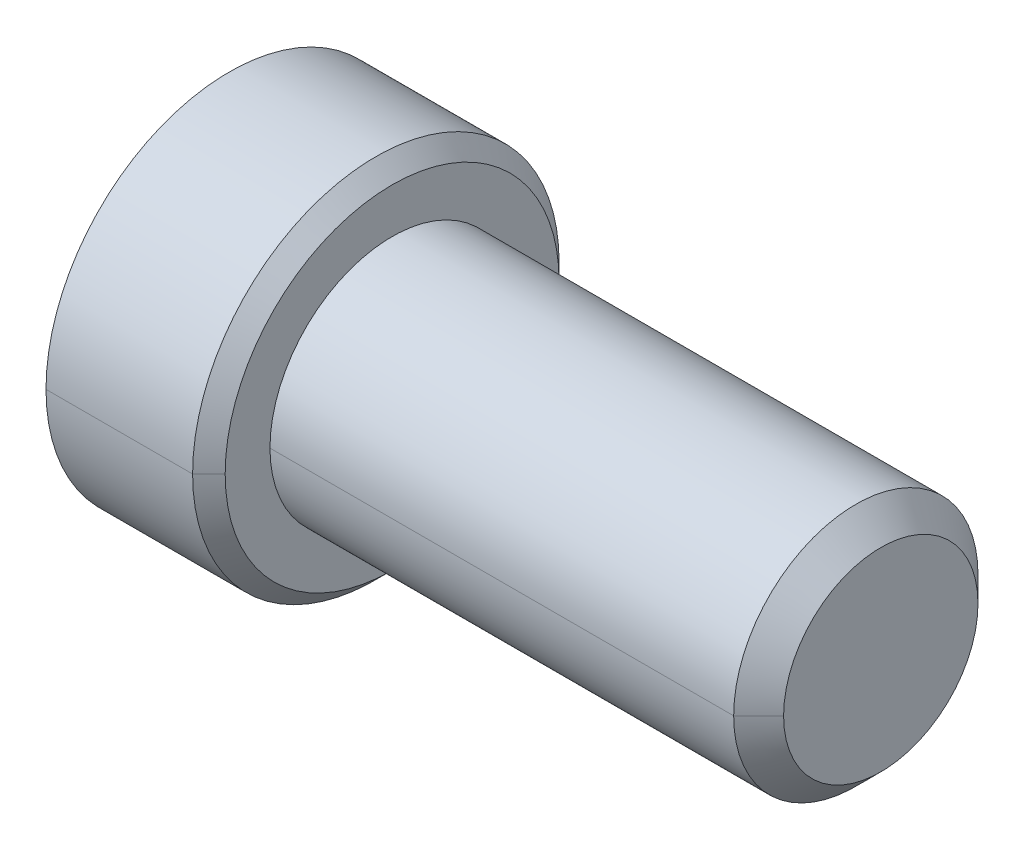
ISO-10303-21;
HEADER;
FILE_DESCRIPTION(('STEP AP214'),'2;1');
FILE_NAME('part.step','',(''),(''),'','','');
FILE_SCHEMA(('AUTOMOTIVE_DESIGN { 1 0 10303 214 1 1 1 1 }'));
ENDSEC;
DATA;
#1=APPLICATION_CONTEXT('core data for automotive mechanical design processes');
#2=APPLICATION_PROTOCOL_DEFINITION('international standard','automotive_design',2000,#1);
#3=PRODUCT_CONTEXT('',#1,'mechanical');
#4=PRODUCT('Part','Part','',(#3));
#5=PRODUCT_RELATED_PRODUCT_CATEGORY('part','',(#4));
#6=PRODUCT_DEFINITION_FORMATION('','',#4);
#7=PRODUCT_DEFINITION_CONTEXT('part definition',#1,'design');
#8=PRODUCT_DEFINITION('design','',#6,#7);
#9=PRODUCT_DEFINITION_SHAPE('','',#8);
#10=(LENGTH_UNIT() NAMED_UNIT(*) SI_UNIT(.MILLI.,.METRE.));
#11=(NAMED_UNIT(*) PLANE_ANGLE_UNIT() SI_UNIT($,.RADIAN.));
#12=(NAMED_UNIT(*) SI_UNIT($,.STERADIAN.) SOLID_ANGLE_UNIT());
#13=UNCERTAINTY_MEASURE_WITH_UNIT(LENGTH_MEASURE(1.E-05),#10,'distance_accuracy_value','');
#14=(GEOMETRIC_REPRESENTATION_CONTEXT(3) GLOBAL_UNCERTAINTY_ASSIGNED_CONTEXT((#13)) GLOBAL_UNIT_ASSIGNED_CONTEXT((#10,
#11,#12)) REPRESENTATION_CONTEXT('',''));
#15=CARTESIAN_POINT('',(0.,0.,0.));
#16=DIRECTION('',(0.,0.,1.));
#17=DIRECTION('',(1.,0.,0.));
#18=AXIS2_PLACEMENT_3D('',#15,#16,#17);
#19=CARTESIAN_POINT('',(6.,1.1935,0.));
#20=DIRECTION('',(-1.,0.,0.));
#21=DIRECTION('',(0.,0.,1.));
#22=AXIS2_PLACEMENT_3D('',#19,#20,#21);
#23=PLANE('',#22);
#24=CARTESIAN_POINT('',(6.,0.,0.));
#25=DIRECTION('',(1.,0.,0.));
#26=DIRECTION('',(0.,0.,-1.));
#27=AXIS2_PLACEMENT_3D('',#24,#25,#26);
#28=CIRCLE('',#27,1.1935);
#29=CARTESIAN_POINT('',(6.,0.,1.1935));
#30=VERTEX_POINT('',#29);
#31=CARTESIAN_POINT('',(6.,0.,-1.1935));
#32=VERTEX_POINT('',#31);
#33=EDGE_CURVE('E9',#30,#32,#28,.T.);
#34=ORIENTED_EDGE('',*,*,#33,.T.);
#35=CARTESIAN_POINT('',(6.,0.,0.));
#36=DIRECTION('',(1.,0.,0.));
#37=DIRECTION('',(0.,0.,-1.));
#38=AXIS2_PLACEMENT_3D('',#35,#36,#37);
#39=CIRCLE('',#38,1.1935);
#40=EDGE_CURVE('E375',#32,#30,#39,.T.);
#41=ORIENTED_EDGE('',*,*,#40,.T.);
#42=EDGE_LOOP('',(#34,#41));
#43=FACE_BOUND('',#42,.T.);
#44=ADVANCED_FACE('F15',(#43),#23,.F.);
#45=CARTESIAN_POINT('',(5.6935,0.,0.));
#46=DIRECTION('',(-1.,0.,0.));
#47=DIRECTION('',(0.,0.,1.));
#48=AXIS2_PLACEMENT_3D('',#45,#46,#47);
#49=CONICAL_SURFACE('',#48,1.5,0.785398163397449);
#50=DIRECTION('',(-0.707106781186547,0.,-0.707106781186548));
#51=VECTOR('',#50,1.);
#52=CARTESIAN_POINT('',(5.6935,0.,-1.5));
#53=LINE('',#52,#51);
#54=CARTESIAN_POINT('',(5.6935,0.,-1.5));
#55=VERTEX_POINT('',#54);
#56=EDGE_CURVE('E366',#32,#55,#53,.T.);
#57=ORIENTED_EDGE('',*,*,#56,.F.);
#58=ORIENTED_EDGE('',*,*,#33,.F.);
#59=DIRECTION('',(-0.707106781186547,0.,0.707106781186548));
#60=VECTOR('',#59,1.);
#61=CARTESIAN_POINT('',(5.6935,0.,1.5));
#62=LINE('',#61,#60);
#63=CARTESIAN_POINT('',(5.6935,0.,1.5));
#64=VERTEX_POINT('',#63);
#65=EDGE_CURVE('E355',#30,#64,#62,.T.);
#66=ORIENTED_EDGE('',*,*,#65,.T.);
#67=CARTESIAN_POINT('',(5.6935,0.,0.));
#68=DIRECTION('',(1.,0.,0.));
#69=DIRECTION('',(0.,0.,-1.));
#70=AXIS2_PLACEMENT_3D('',#67,#68,#69);
#71=CIRCLE('',#70,1.5);
#72=EDGE_CURVE('E23',#64,#55,#71,.T.);
#73=ORIENTED_EDGE('',*,*,#72,.T.);
#74=EDGE_LOOP('',(#57,#58,#66,#73));
#75=FACE_BOUND('',#74,.T.);
#76=ADVANCED_FACE('F416',(#75),#49,.T.);
#77=CARTESIAN_POINT('',(6.,0.,0.));
#78=DIRECTION('',(1.,0.,0.));
#79=DIRECTION('',(0.,0.,-1.));
#80=AXIS2_PLACEMENT_3D('',#77,#78,#79);
#81=CYLINDRICAL_SURFACE('',#80,1.5);
#82=DIRECTION('',(1.,0.,0.));
#83=VECTOR('',#82,1.);
#84=CARTESIAN_POINT('',(6.,0.,1.5));
#85=LINE('',#84,#83);
#86=CARTESIAN_POINT('',(0.,0.,1.5));
#87=VERTEX_POINT('',#86);
#88=EDGE_CURVE('E211',#87,#64,#85,.T.);
#89=ORIENTED_EDGE('',*,*,#88,.F.);
#90=CARTESIAN_POINT('',(0.,0.,0.));
#91=DIRECTION('',(1.,0.,0.));
#92=DIRECTION('',(0.,0.,-1.));
#93=AXIS2_PLACEMENT_3D('',#90,#91,#92);
#94=CIRCLE('',#93,1.5);
#95=CARTESIAN_POINT('',(0.,0.,-1.5));
#96=VERTEX_POINT('',#95);
#97=EDGE_CURVE('E253',#87,#96,#94,.T.);
#98=ORIENTED_EDGE('',*,*,#97,.T.);
#99=DIRECTION('',(1.,0.,0.));
#100=VECTOR('',#99,1.);
#101=CARTESIAN_POINT('',(6.,0.,-1.5));
#102=LINE('',#101,#100);
#103=EDGE_CURVE('E215',#96,#55,#102,.T.);
#104=ORIENTED_EDGE('',*,*,#103,.T.);
#105=ORIENTED_EDGE('',*,*,#72,.F.);
#106=EDGE_LOOP('',(#89,#98,#104,#105));
#107=FACE_BOUND('',#106,.T.);
#108=ADVANCED_FACE('F341',(#107),#81,.T.);
#109=CARTESIAN_POINT('',(-0.5,0.,0.));
#110=DIRECTION('',(-1.,0.,0.));
#111=DIRECTION('',(0.,0.,1.));
#112=AXIS2_PLACEMENT_3D('',#109,#110,#111);
#113=CONICAL_SURFACE('',#112,1.,1.0471975511966);
#114=DIRECTION('',(-0.5,0.,-0.866025403784439));
#115=VECTOR('',#114,1.);
#116=CARTESIAN_POINT('',(-0.5,0.,-1.));
#117=LINE('',#116,#115);
#118=CARTESIAN_POINT('',(0.077350269189626,0.,0.));
#119=VERTEX_POINT('',#118);
#120=CARTESIAN_POINT('',(-0.5,0.,-1.));
#121=VERTEX_POINT('',#120);
#122=EDGE_CURVE('E205',#119,#121,#117,.T.);
#123=ORIENTED_EDGE('',*,*,#122,.F.);
#124=DIRECTION('',(-0.5,0.,0.866025403784439));
#125=VECTOR('',#124,1.);
#126=CARTESIAN_POINT('',(-0.5,0.,1.));
#127=LINE('',#126,#125);
#128=CARTESIAN_POINT('',(-0.5,0.,1.));
#129=VERTEX_POINT('',#128);
#130=EDGE_CURVE('E216',#119,#129,#127,.T.);
#131=ORIENTED_EDGE('',*,*,#130,.T.);
#132=CARTESIAN_POINT('',(-0.5,0.,0.));
#133=DIRECTION('',(1.,0.,0.));
#134=DIRECTION('',(0.,0.866025403784422,0.500000000000029));
#135=AXIS2_PLACEMENT_3D('',#132,#133,#134);
#136=CIRCLE('',#135,1.);
#137=CARTESIAN_POINT('',(-0.5,0.866025403784442,0.50000000000004));
#138=VERTEX_POINT('',#137);
#139=EDGE_CURVE('E231',#138,#129,#136,.T.);
#140=ORIENTED_EDGE('',*,*,#139,.F.);
#141=CARTESIAN_POINT('',(-0.5,0.,0.));
#142=DIRECTION('',(1.,0.,0.));
#143=DIRECTION('',(0.,0.866025403784422,-0.500000000000029));
#144=AXIS2_PLACEMENT_3D('',#141,#142,#143);
#145=CIRCLE('',#144,1.);
#146=CARTESIAN_POINT('',(-0.5,0.866025403784442,-0.50000000000004));
#147=VERTEX_POINT('',#146);
#148=EDGE_CURVE('E227',#147,#138,#145,.T.);
#149=ORIENTED_EDGE('',*,*,#148,.F.);
#150=CARTESIAN_POINT('',(-0.5,0.,0.));
#151=DIRECTION('',(1.,0.,0.));
#152=DIRECTION('',(0.,0.,-1.));
#153=AXIS2_PLACEMENT_3D('',#150,#151,#152);
#154=CIRCLE('',#153,1.);
#155=EDGE_CURVE('E232',#121,#147,#154,.T.);
#156=ORIENTED_EDGE('',*,*,#155,.F.);
#157=EDGE_LOOP('',(#123,#131,#140,#149,#156));
#158=FACE_BOUND('',#157,.T.);
#159=ADVANCED_FACE('F404',(#158),#113,.F.);
#160=CARTESIAN_POINT('',(0.,2.05,0.));
#161=DIRECTION('',(-1.,0.,0.));
#162=DIRECTION('',(0.,0.,1.));
#163=AXIS2_PLACEMENT_3D('',#160,#161,#162);
#164=PLANE('',#163);
#165=CARTESIAN_POINT('',(0.,0.,0.));
#166=DIRECTION('',(1.,0.,0.));
#167=DIRECTION('',(0.,0.,-1.));
#168=AXIS2_PLACEMENT_3D('',#165,#166,#167);
#169=CIRCLE('',#168,1.5);
#170=EDGE_CURVE('E209',#96,#87,#169,.T.);
#171=ORIENTED_EDGE('',*,*,#170,.F.);
#172=ORIENTED_EDGE('',*,*,#97,.F.);
#173=EDGE_LOOP('',(#171,#172));
#174=FACE_BOUND('',#173,.T.);
#175=CARTESIAN_POINT('',(0.,0.,0.));
#176=DIRECTION('',(1.,0.,0.));
#177=DIRECTION('',(0.,0.,-1.));
#178=AXIS2_PLACEMENT_3D('',#175,#176,#177);
#179=CIRCLE('',#178,2.05);
#180=CARTESIAN_POINT('',(0.,0.,2.05));
#181=VERTEX_POINT('',#180);
#182=CARTESIAN_POINT('',(0.,0.,-2.05));
#183=VERTEX_POINT('',#182);
#184=EDGE_CURVE('E177',#181,#183,#179,.T.);
#185=ORIENTED_EDGE('',*,*,#184,.T.);
#186=CARTESIAN_POINT('',(0.,0.,0.));
#187=DIRECTION('',(1.,0.,0.));
#188=DIRECTION('',(0.,0.,-1.));
#189=AXIS2_PLACEMENT_3D('',#186,#187,#188);
#190=CIRCLE('',#189,2.05);
#191=EDGE_CURVE('E193',#183,#181,#190,.T.);
#192=ORIENTED_EDGE('',*,*,#191,.T.);
#193=EDGE_LOOP('',(#185,#192));
#194=FACE_BOUND('',#193,.T.);
#195=ADVANCED_FACE('F352',(#174,#194),#164,.F.);
#196=CARTESIAN_POINT('',(-0.5,0.,0.));
#197=DIRECTION('',(1.,0.,0.));
#198=DIRECTION('',(0.,1.,0.));
#199=AXIS2_PLACEMENT_3D('',#196,#197,#198);
#200=PLANE('',#199);
#201=CARTESIAN_POINT('',(-0.5,0.,0.));
#202=DIRECTION('',(1.,0.,0.));
#203=DIRECTION('',(0.,0.,1.));
#204=AXIS2_PLACEMENT_3D('',#201,#202,#203);
#205=CIRCLE('',#204,1.);
#206=CARTESIAN_POINT('',(-0.5,-0.866025403784442,0.50000000000004));
#207=VERTEX_POINT('',#206);
#208=EDGE_CURVE('E186',#129,#207,#205,.T.);
#209=ORIENTED_EDGE('',*,*,#208,.T.);
#210=DIRECTION('',(0.,-0.500000000000029,-0.866025403784422));
#211=VECTOR('',#210,1.);
#212=CARTESIAN_POINT('',(-0.5,-0.57735026918963,1.));
#213=LINE('',#212,#211);
#214=CARTESIAN_POINT('',(-0.5,-0.57735026918963,1.));
#215=VERTEX_POINT('',#214);
#216=EDGE_CURVE('E36',#215,#207,#213,.T.);
#217=ORIENTED_EDGE('',*,*,#216,.F.);
#218=DIRECTION('',(0.,-1.,0.));
#219=VECTOR('',#218,1.);
#220=CARTESIAN_POINT('',(-0.5,0.,1.));
#221=LINE('',#220,#219);
#222=EDGE_CURVE('E188',#129,#215,#221,.T.);
#223=ORIENTED_EDGE('',*,*,#222,.F.);
#224=EDGE_LOOP('',(#209,#217,#223));
#225=FACE_BOUND('',#224,.T.);
#226=ADVANCED_FACE('F187',(#225),#200,.F.);
#227=CARTESIAN_POINT('',(-0.5,0.,0.));
#228=DIRECTION('',(1.,0.,0.));
#229=DIRECTION('',(0.,1.,0.));
#230=AXIS2_PLACEMENT_3D('',#227,#228,#229);
#231=PLANE('',#230);
#232=ORIENTED_EDGE('',*,*,#139,.T.);
#233=DIRECTION('',(0.,-1.,0.));
#234=VECTOR('',#233,1.);
#235=CARTESIAN_POINT('',(-0.5,0.57735026918963,1.));
#236=LINE('',#235,#234);
#237=CARTESIAN_POINT('',(-0.5,0.57735026918963,1.));
#238=VERTEX_POINT('',#237);
#239=EDGE_CURVE('E47',#238,#129,#236,.T.);
#240=ORIENTED_EDGE('',*,*,#239,.F.);
#241=DIRECTION('',(0.,-0.500000000000029,0.866025403784422));
#242=VECTOR('',#241,1.);
#243=CARTESIAN_POINT('',(-0.5,0.866025403784442,0.50000000000004));
#244=LINE('',#243,#242);
#245=EDGE_CURVE('E275',#138,#238,#244,.T.);
#246=ORIENTED_EDGE('',*,*,#245,.F.);
#247=EDGE_LOOP('',(#232,#240,#246));
#248=FACE_BOUND('',#247,.T.);
#249=ADVANCED_FACE('F411',(#248),#231,.F.);
#250=CARTESIAN_POINT('',(-0.5,0.,0.));
#251=DIRECTION('',(1.,0.,0.));
#252=DIRECTION('',(0.,1.,0.));
#253=AXIS2_PLACEMENT_3D('',#250,#251,#252);
#254=PLANE('',#253);
#255=DIRECTION('',(0.,0.500000000000029,0.866025403784422));
#256=VECTOR('',#255,1.);
#257=CARTESIAN_POINT('',(-0.5,0.866025403784442,-0.50000000000004));
#258=LINE('',#257,#256);
#259=CARTESIAN_POINT('',(-0.5,1.1547005383793,0.));
#260=VERTEX_POINT('',#259);
#261=EDGE_CURVE('E310',#147,#260,#258,.T.);
#262=ORIENTED_EDGE('',*,*,#261,.F.);
#263=ORIENTED_EDGE('',*,*,#148,.T.);
#264=DIRECTION('',(0.,-0.500000000000029,0.866025403784422));
#265=VECTOR('',#264,1.);
#266=CARTESIAN_POINT('',(-0.5,1.1547005383793,0.));
#267=LINE('',#266,#265);
#268=EDGE_CURVE('E280',#260,#138,#267,.T.);
#269=ORIENTED_EDGE('',*,*,#268,.F.);
#270=EDGE_LOOP('',(#262,#263,#269));
#271=FACE_BOUND('',#270,.T.);
#272=ADVANCED_FACE('F476',(#271),#254,.F.);
#273=CARTESIAN_POINT('',(-0.5,0.,0.));
#274=DIRECTION('',(1.,0.,0.));
#275=DIRECTION('',(0.,1.,0.));
#276=AXIS2_PLACEMENT_3D('',#273,#274,#275);
#277=PLANE('',#276);
#278=ORIENTED_EDGE('',*,*,#155,.T.);
#279=DIRECTION('',(0.,0.500000000000029,0.866025403784422));
#280=VECTOR('',#279,1.);
#281=CARTESIAN_POINT('',(-0.5,0.57735026918963,-1.));
#282=LINE('',#281,#280);
#283=CARTESIAN_POINT('',(-0.5,0.57735026918963,-1.));
#284=VERTEX_POINT('',#283);
#285=EDGE_CURVE('E306',#284,#147,#282,.T.);
#286=ORIENTED_EDGE('',*,*,#285,.F.);
#287=DIRECTION('',(0.,1.,0.));
#288=VECTOR('',#287,1.);
#289=CARTESIAN_POINT('',(-0.5,0.,-1.));
#290=LINE('',#289,#288);
#291=EDGE_CURVE('E299',#121,#284,#290,.T.);
#292=ORIENTED_EDGE('',*,*,#291,.F.);
#293=EDGE_LOOP('',(#278,#286,#292));
#294=FACE_BOUND('',#293,.T.);
#295=ADVANCED_FACE('F472',(#294),#277,.F.);
#296=CARTESIAN_POINT('',(-0.5,0.,0.));
#297=DIRECTION('',(1.,0.,0.));
#298=DIRECTION('',(0.,1.,0.));
#299=AXIS2_PLACEMENT_3D('',#296,#297,#298);
#300=PLANE('',#299);
#301=CARTESIAN_POINT('',(-0.5,0.,0.));
#302=DIRECTION('',(1.,0.,0.));
#303=DIRECTION('',(0.,-0.866025403784422,-0.500000000000029));
#304=AXIS2_PLACEMENT_3D('',#301,#302,#303);
#305=CIRCLE('',#304,1.);
#306=CARTESIAN_POINT('',(-0.5,-0.866025403784422,-0.500000000000029));
#307=VERTEX_POINT('',#306);
#308=EDGE_CURVE('E198',#307,#121,#305,.T.);
#309=ORIENTED_EDGE('',*,*,#308,.T.);
#310=DIRECTION('',(0.,1.,0.));
#311=VECTOR('',#310,1.);
#312=CARTESIAN_POINT('',(-0.5,-0.57735026918963,-1.));
#313=LINE('',#312,#311);
#314=CARTESIAN_POINT('',(-0.5,-0.57735026918963,-1.));
#315=VERTEX_POINT('',#314);
#316=EDGE_CURVE('E295',#315,#121,#313,.T.);
#317=ORIENTED_EDGE('',*,*,#316,.F.);
#318=DIRECTION('',(0.,0.500000000000029,-0.866025403784422));
#319=VECTOR('',#318,1.);
#320=CARTESIAN_POINT('',(-0.5,-0.866025403784442,-0.500000000000041));
#321=LINE('',#320,#319);
#322=EDGE_CURVE('E288',#307,#315,#321,.T.);
#323=ORIENTED_EDGE('',*,*,#322,.F.);
#324=EDGE_LOOP('',(#309,#317,#323));
#325=FACE_BOUND('',#324,.T.);
#326=ADVANCED_FACE('F444',(#325),#300,.F.);
#327=CARTESIAN_POINT('',(-0.5,0.,0.));
#328=DIRECTION('',(1.,0.,0.));
#329=DIRECTION('',(0.,1.,0.));
#330=AXIS2_PLACEMENT_3D('',#327,#328,#329);
#331=PLANE('',#330);
#332=CARTESIAN_POINT('',(-0.5,0.,0.));
#333=DIRECTION('',(1.,0.,0.));
#334=DIRECTION('',(0.,-0.866025403784422,0.500000000000029));
#335=AXIS2_PLACEMENT_3D('',#332,#333,#334);
#336=CIRCLE('',#335,1.);
#337=EDGE_CURVE('E170',#207,#307,#336,.T.);
#338=ORIENTED_EDGE('',*,*,#337,.T.);
#339=DIRECTION('',(0.,0.500000000000029,-0.866025403784422));
#340=VECTOR('',#339,1.);
#341=CARTESIAN_POINT('',(-0.5,-1.1547005383793,0.));
#342=LINE('',#341,#340);
#343=CARTESIAN_POINT('',(-0.5,-1.1547005383793,0.));
#344=VERTEX_POINT('',#343);
#345=EDGE_CURVE('E173',#344,#307,#342,.T.);
#346=ORIENTED_EDGE('',*,*,#345,.F.);
#347=DIRECTION('',(0.,-0.500000000000029,-0.866025403784422));
#348=VECTOR('',#347,1.);
#349=CARTESIAN_POINT('',(-0.5,-0.866025403784442,0.50000000000004));
#350=LINE('',#349,#348);
#351=EDGE_CURVE('E167',#207,#344,#350,.T.);
#352=ORIENTED_EDGE('',*,*,#351,.F.);
#353=EDGE_LOOP('',(#338,#346,#352));
#354=FACE_BOUND('',#353,.T.);
#355=ADVANCED_FACE('F168',(#354),#331,.F.);
#356=CARTESIAN_POINT('',(-0.2,0.,0.));
#357=DIRECTION('',(-1.,0.,0.));
#358=DIRECTION('',(0.,0.,1.));
#359=AXIS2_PLACEMENT_3D('',#356,#357,#358);
#360=CONICAL_SURFACE('',#359,2.25,0.785398163397448);
#361=DIRECTION('',(-0.707106781186548,0.,-0.707106781186547));
#362=VECTOR('',#361,1.);
#363=CARTESIAN_POINT('',(-0.2,0.,-2.25));
#364=LINE('',#363,#362);
#365=CARTESIAN_POINT('',(-0.2,0.,-2.25));
#366=VERTEX_POINT('',#365);
#367=EDGE_CURVE('E236',#183,#366,#364,.T.);
#368=ORIENTED_EDGE('',*,*,#367,.F.);
#369=ORIENTED_EDGE('',*,*,#184,.F.);
#370=DIRECTION('',(-0.707106781186548,0.,0.707106781186547));
#371=VECTOR('',#370,1.);
#372=CARTESIAN_POINT('',(-0.2,0.,2.25));
#373=LINE('',#372,#371);
#374=CARTESIAN_POINT('',(-0.2,0.,2.25));
#375=VERTEX_POINT('',#374);
#376=EDGE_CURVE('E372',#181,#375,#373,.T.);
#377=ORIENTED_EDGE('',*,*,#376,.T.);
#378=CARTESIAN_POINT('',(-0.2,0.,0.));
#379=DIRECTION('',(1.,0.,0.));
#380=DIRECTION('',(0.,0.,-1.));
#381=AXIS2_PLACEMENT_3D('',#378,#379,#380);
#382=CIRCLE('',#381,2.25);
#383=EDGE_CURVE('E274',#375,#366,#382,.T.);
#384=ORIENTED_EDGE('',*,*,#383,.T.);
#385=EDGE_LOOP('',(#368,#369,#377,#384));
#386=FACE_BOUND('',#385,.T.);
#387=ADVANCED_FACE('F398',(#386),#360,.T.);
#388=CARTESIAN_POINT('',(-0.5,-0.57735026918963,1.));
#389=DIRECTION('',(0.,0.866025403784422,-0.500000000000029));
#390=DIRECTION('',(-1.,0.,0.));
#391=AXIS2_PLACEMENT_3D('',#388,#389,#390);
#392=PLANE('',#391);
#393=DIRECTION('',(0.,-0.500000000000029,-0.866025403784422));
#394=VECTOR('',#393,1.);
#395=CARTESIAN_POINT('',(-2.,-0.57735026918963,1.));
#396=LINE('',#395,#394);
#397=CARTESIAN_POINT('',(-2.,-0.57735026918963,1.));
#398=VERTEX_POINT('',#397);
#399=CARTESIAN_POINT('',(-2.,-1.1547005383793,0.));
#400=VERTEX_POINT('',#399);
#401=EDGE_CURVE('E270',#398,#400,#396,.T.);
#402=ORIENTED_EDGE('',*,*,#401,.F.);
#403=DIRECTION('',(-1.,0.,0.));
#404=VECTOR('',#403,1.);
#405=CARTESIAN_POINT('',(-0.5,-0.57735026918963,1.));
#406=LINE('',#405,#404);
#407=EDGE_CURVE('E181',#215,#398,#406,.T.);
#408=ORIENTED_EDGE('',*,*,#407,.F.);
#409=ORIENTED_EDGE('',*,*,#216,.T.);
#410=ORIENTED_EDGE('',*,*,#351,.T.);
#411=DIRECTION('',(-1.,0.,0.));
#412=VECTOR('',#411,1.);
#413=CARTESIAN_POINT('',(-0.5,-1.1547005383793,0.));
#414=LINE('',#413,#412);
#415=EDGE_CURVE('E283',#344,#400,#414,.T.);
#416=ORIENTED_EDGE('',*,*,#415,.T.);
#417=EDGE_LOOP('',(#402,#408,#409,#410,#416));
#418=FACE_BOUND('',#417,.T.);
#419=ADVANCED_FACE('F180',(#418),#392,.T.);
#420=CARTESIAN_POINT('',(-0.5,0.57735026918963,1.));
#421=DIRECTION('',(0.,0.,-1.));
#422=DIRECTION('',(0.,-1.,0.));
#423=AXIS2_PLACEMENT_3D('',#420,#421,#422);
#424=PLANE('',#423);
#425=DIRECTION('',(0.,-1.,0.));
#426=VECTOR('',#425,1.);
#427=CARTESIAN_POINT('',(-2.,0.57735026918963,1.));
#428=LINE('',#427,#426);
#429=CARTESIAN_POINT('',(-2.,0.57735026918963,1.));
#430=VERTEX_POINT('',#429);
#431=EDGE_CURVE('E266',#430,#398,#428,.T.);
#432=ORIENTED_EDGE('',*,*,#431,.F.);
#433=DIRECTION('',(-1.,0.,0.));
#434=VECTOR('',#433,1.);
#435=CARTESIAN_POINT('',(-0.5,0.57735026918963,1.));
#436=LINE('',#435,#434);
#437=EDGE_CURVE('E279',#238,#430,#436,.T.);
#438=ORIENTED_EDGE('',*,*,#437,.F.);
#439=ORIENTED_EDGE('',*,*,#239,.T.);
#440=ORIENTED_EDGE('',*,*,#222,.T.);
#441=ORIENTED_EDGE('',*,*,#407,.T.);
#442=EDGE_LOOP('',(#432,#438,#439,#440,#441));
#443=FACE_BOUND('',#442,.T.);
#444=ADVANCED_FACE('F440',(#443),#424,.T.);
#445=CARTESIAN_POINT('',(-0.5,1.1547005383793,0.));
#446=DIRECTION('',(0.,-0.866025403784422,-0.500000000000029));
#447=DIRECTION('',(0.,0.500000000000029,-0.866025403784422));
#448=AXIS2_PLACEMENT_3D('',#445,#446,#447);
#449=PLANE('',#448);
#450=DIRECTION('',(0.,-0.500000000000029,0.866025403784422));
#451=VECTOR('',#450,1.);
#452=CARTESIAN_POINT('',(-2.,1.1547005383793,0.));
#453=LINE('',#452,#451);
#454=CARTESIAN_POINT('',(-2.,1.1547005383793,0.));
#455=VERTEX_POINT('',#454);
#456=EDGE_CURVE('E224',#455,#430,#453,.T.);
#457=ORIENTED_EDGE('',*,*,#456,.F.);
#458=DIRECTION('',(-1.,0.,0.));
#459=VECTOR('',#458,1.);
#460=CARTESIAN_POINT('',(-0.5,1.1547005383793,0.));
#461=LINE('',#460,#459);
#462=EDGE_CURVE('E314',#260,#455,#461,.T.);
#463=ORIENTED_EDGE('',*,*,#462,.F.);
#464=ORIENTED_EDGE('',*,*,#268,.T.);
#465=ORIENTED_EDGE('',*,*,#245,.T.);
#466=ORIENTED_EDGE('',*,*,#437,.T.);
#467=EDGE_LOOP('',(#457,#463,#464,#465,#466));
#468=FACE_BOUND('',#467,.T.);
#469=ADVANCED_FACE('F436',(#468),#449,.T.);
#470=CARTESIAN_POINT('',(-0.5,0.57735026918963,-1.));
#471=DIRECTION('',(0.,-0.866025403784422,0.500000000000029));
#472=DIRECTION('',(-1.,0.,0.));
#473=AXIS2_PLACEMENT_3D('',#470,#471,#472);
#474=PLANE('',#473);
#475=DIRECTION('',(0.,0.500000000000029,0.866025403784422));
#476=VECTOR('',#475,1.);
#477=CARTESIAN_POINT('',(-2.,0.57735026918963,-1.));
#478=LINE('',#477,#476);
#479=CARTESIAN_POINT('',(-2.,0.57735026918963,-1.));
#480=VERTEX_POINT('',#479);
#481=EDGE_CURVE('E221',#480,#455,#478,.T.);
#482=ORIENTED_EDGE('',*,*,#481,.F.);
#483=DIRECTION('',(-1.,0.,0.));
#484=VECTOR('',#483,1.);
#485=CARTESIAN_POINT('',(-0.5,0.57735026918963,-1.));
#486=LINE('',#485,#484);
#487=EDGE_CURVE('E303',#284,#480,#486,.T.);
#488=ORIENTED_EDGE('',*,*,#487,.F.);
#489=ORIENTED_EDGE('',*,*,#285,.T.);
#490=ORIENTED_EDGE('',*,*,#261,.T.);
#491=ORIENTED_EDGE('',*,*,#462,.T.);
#492=EDGE_LOOP('',(#482,#488,#489,#490,#491));
#493=FACE_BOUND('',#492,.T.);
#494=ADVANCED_FACE('F439',(#493),#474,.T.);
#495=CARTESIAN_POINT('',(-0.5,-0.57735026918963,-1.));
#496=DIRECTION('',(0.,0.,1.));
#497=DIRECTION('',(1.,0.,0.));
#498=AXIS2_PLACEMENT_3D('',#495,#496,#497);
#499=PLANE('',#498);
#500=DIRECTION('',(0.,1.,0.));
#501=VECTOR('',#500,1.);
#502=CARTESIAN_POINT('',(-2.,-0.57735026918963,-1.));
#503=LINE('',#502,#501);
#504=CARTESIAN_POINT('',(-2.,-0.57735026918963,-1.));
#505=VERTEX_POINT('',#504);
#506=EDGE_CURVE('E225',#505,#480,#503,.T.);
#507=ORIENTED_EDGE('',*,*,#506,.F.);
#508=DIRECTION('',(-1.,0.,0.));
#509=VECTOR('',#508,1.);
#510=CARTESIAN_POINT('',(-0.5,-0.57735026918963,-1.));
#511=LINE('',#510,#509);
#512=EDGE_CURVE('E292',#315,#505,#511,.T.);
#513=ORIENTED_EDGE('',*,*,#512,.F.);
#514=ORIENTED_EDGE('',*,*,#316,.T.);
#515=ORIENTED_EDGE('',*,*,#291,.T.);
#516=ORIENTED_EDGE('',*,*,#487,.T.);
#517=EDGE_LOOP('',(#507,#513,#514,#515,#516));
#518=FACE_BOUND('',#517,.T.);
#519=ADVANCED_FACE('F457',(#518),#499,.T.);
#520=CARTESIAN_POINT('',(-0.5,-1.1547005383793,0.));
#521=DIRECTION('',(0.,0.866025403784422,0.500000000000029));
#522=DIRECTION('',(1.,0.,0.));
#523=AXIS2_PLACEMENT_3D('',#520,#521,#522);
#524=PLANE('',#523);
#525=DIRECTION('',(0.,0.500000000000029,-0.866025403784422));
#526=VECTOR('',#525,1.);
#527=CARTESIAN_POINT('',(-2.,-1.1547005383793,0.));
#528=LINE('',#527,#526);
#529=EDGE_CURVE('E256',#400,#505,#528,.T.);
#530=ORIENTED_EDGE('',*,*,#529,.F.);
#531=ORIENTED_EDGE('',*,*,#415,.F.);
#532=ORIENTED_EDGE('',*,*,#345,.T.);
#533=ORIENTED_EDGE('',*,*,#322,.T.);
#534=ORIENTED_EDGE('',*,*,#512,.T.);
#535=EDGE_LOOP('',(#530,#531,#532,#533,#534));
#536=FACE_BOUND('',#535,.T.);
#537=ADVANCED_FACE('F454',(#536),#524,.T.);
#538=CARTESIAN_POINT('',(6.,0.,0.));
#539=DIRECTION('',(1.,0.,0.));
#540=DIRECTION('',(0.,0.,-1.));
#541=AXIS2_PLACEMENT_3D('',#538,#539,#540);
#542=CYLINDRICAL_SURFACE('',#541,2.25);
#543=DIRECTION('',(1.,0.,0.));
#544=VECTOR('',#543,1.);
#545=CARTESIAN_POINT('',(6.,0.,2.25));
#546=LINE('',#545,#544);
#547=CARTESIAN_POINT('',(-2.,0.,2.25));
#548=VERTEX_POINT('',#547);
#549=EDGE_CURVE('E241',#548,#375,#546,.T.);
#550=ORIENTED_EDGE('',*,*,#549,.F.);
#551=CARTESIAN_POINT('',(-2.,0.,0.));
#552=DIRECTION('',(1.,0.,0.));
#553=DIRECTION('',(0.,0.,-1.));
#554=AXIS2_PLACEMENT_3D('',#551,#552,#553);
#555=CIRCLE('',#554,2.25);
#556=CARTESIAN_POINT('',(-2.,0.,-2.25));
#557=VERTEX_POINT('',#556);
#558=EDGE_CURVE('E250',#548,#557,#555,.T.);
#559=ORIENTED_EDGE('',*,*,#558,.T.);
#560=DIRECTION('',(1.,0.,0.));
#561=VECTOR('',#560,1.);
#562=CARTESIAN_POINT('',(6.,0.,-2.25));
#563=LINE('',#562,#561);
#564=EDGE_CURVE('E245',#557,#366,#563,.T.);
#565=ORIENTED_EDGE('',*,*,#564,.T.);
#566=ORIENTED_EDGE('',*,*,#383,.F.);
#567=EDGE_LOOP('',(#550,#559,#565,#566));
#568=FACE_BOUND('',#567,.T.);
#569=ADVANCED_FACE('F395',(#568),#542,.T.);
#570=CARTESIAN_POINT('',(-2.,0.,0.));
#571=DIRECTION('',(1.,0.,0.));
#572=DIRECTION('',(0.,1.,0.));
#573=AXIS2_PLACEMENT_3D('',#570,#571,#572);
#574=PLANE('',#573);
#575=ORIENTED_EDGE('',*,*,#529,.T.);
#576=ORIENTED_EDGE('',*,*,#506,.T.);
#577=ORIENTED_EDGE('',*,*,#481,.T.);
#578=ORIENTED_EDGE('',*,*,#456,.T.);
#579=ORIENTED_EDGE('',*,*,#431,.T.);
#580=ORIENTED_EDGE('',*,*,#401,.T.);
#581=EDGE_LOOP('',(#575,#576,#577,#578,#579,#580));
#582=FACE_BOUND('',#581,.T.);
#583=CARTESIAN_POINT('',(-2.,0.,0.));
#584=DIRECTION('',(1.,0.,0.));
#585=DIRECTION('',(0.,0.,-1.));
#586=AXIS2_PLACEMENT_3D('',#583,#584,#585);
#587=CIRCLE('',#586,2.25);
#588=EDGE_CURVE('E246',#557,#548,#587,.T.);
#589=ORIENTED_EDGE('',*,*,#588,.F.);
#590=ORIENTED_EDGE('',*,*,#558,.F.);
#591=EDGE_LOOP('',(#589,#590));
#592=FACE_BOUND('',#591,.T.);
#593=ADVANCED_FACE('F393',(#582,#592),#574,.F.);
#594=CARTESIAN_POINT('',(6.,0.,0.));
#595=DIRECTION('',(1.,0.,0.));
#596=DIRECTION('',(0.,0.,-1.));
#597=AXIS2_PLACEMENT_3D('',#594,#595,#596);
#598=CYLINDRICAL_SURFACE('',#597,2.25);
#599=ORIENTED_EDGE('',*,*,#588,.T.);
#600=ORIENTED_EDGE('',*,*,#549,.T.);
#601=CARTESIAN_POINT('',(-0.2,0.,0.));
#602=DIRECTION('',(1.,0.,0.));
#603=DIRECTION('',(0.,0.,-1.));
#604=AXIS2_PLACEMENT_3D('',#601,#602,#603);
#605=CIRCLE('',#604,2.25);
#606=EDGE_CURVE('E240',#366,#375,#605,.T.);
#607=ORIENTED_EDGE('',*,*,#606,.F.);
#608=ORIENTED_EDGE('',*,*,#564,.F.);
#609=EDGE_LOOP('',(#599,#600,#607,#608));
#610=FACE_BOUND('',#609,.T.);
#611=ADVANCED_FACE('F389',(#610),#598,.T.);
#612=CARTESIAN_POINT('',(-0.2,0.,0.));
#613=DIRECTION('',(-1.,0.,0.));
#614=DIRECTION('',(0.,0.,1.));
#615=AXIS2_PLACEMENT_3D('',#612,#613,#614);
#616=CONICAL_SURFACE('',#615,2.25,0.785398163397448);
#617=ORIENTED_EDGE('',*,*,#191,.F.);
#618=ORIENTED_EDGE('',*,*,#367,.T.);
#619=ORIENTED_EDGE('',*,*,#606,.T.);
#620=ORIENTED_EDGE('',*,*,#376,.F.);
#621=EDGE_LOOP('',(#617,#618,#619,#620));
#622=FACE_BOUND('',#621,.T.);
#623=ADVANCED_FACE('F402',(#622),#616,.T.);
#624=CARTESIAN_POINT('',(-0.5,0.,0.));
#625=DIRECTION('',(-1.,0.,0.));
#626=DIRECTION('',(0.,0.,1.));
#627=AXIS2_PLACEMENT_3D('',#624,#625,#626);
#628=CONICAL_SURFACE('',#627,1.,1.0471975511966);
#629=ORIENTED_EDGE('',*,*,#130,.F.);
#630=ORIENTED_EDGE('',*,*,#122,.T.);
#631=ORIENTED_EDGE('',*,*,#308,.F.);
#632=ORIENTED_EDGE('',*,*,#337,.F.);
#633=ORIENTED_EDGE('',*,*,#208,.F.);
#634=EDGE_LOOP('',(#629,#630,#631,#632,#633));
#635=FACE_BOUND('',#634,.T.);
#636=ADVANCED_FACE('F195',(#635),#628,.F.);
#637=CARTESIAN_POINT('',(6.,0.,0.));
#638=DIRECTION('',(1.,0.,0.));
#639=DIRECTION('',(0.,0.,-1.));
#640=AXIS2_PLACEMENT_3D('',#637,#638,#639);
#641=CYLINDRICAL_SURFACE('',#640,1.5);
#642=ORIENTED_EDGE('',*,*,#170,.T.);
#643=ORIENTED_EDGE('',*,*,#88,.T.);
#644=CARTESIAN_POINT('',(5.6935,0.,0.));
#645=DIRECTION('',(1.,0.,0.));
#646=DIRECTION('',(0.,0.,-1.));
#647=AXIS2_PLACEMENT_3D('',#644,#645,#646);
#648=CIRCLE('',#647,1.5);
#649=EDGE_CURVE('E349',#55,#64,#648,.T.);
#650=ORIENTED_EDGE('',*,*,#649,.F.);
#651=ORIENTED_EDGE('',*,*,#103,.F.);
#652=EDGE_LOOP('',(#642,#643,#650,#651));
#653=FACE_BOUND('',#652,.T.);
#654=ADVANCED_FACE('F347',(#653),#641,.T.);
#655=CARTESIAN_POINT('',(5.6935,0.,0.));
#656=DIRECTION('',(-1.,0.,0.));
#657=DIRECTION('',(0.,0.,1.));
#658=AXIS2_PLACEMENT_3D('',#655,#656,#657);
#659=CONICAL_SURFACE('',#658,1.5,0.785398163397449);
#660=ORIENTED_EDGE('',*,*,#40,.F.);
#661=ORIENTED_EDGE('',*,*,#56,.T.);
#662=ORIENTED_EDGE('',*,*,#649,.T.);
#663=ORIENTED_EDGE('',*,*,#65,.F.);
#664=EDGE_LOOP('',(#660,#661,#662,#663));
#665=FACE_BOUND('',#664,.T.);
#666=ADVANCED_FACE('F424',(#665),#659,.T.);
#667=CLOSED_SHELL('',(#44,#76,#108,#159,#195,#226,#249,#272,#295,#326,#355,#387,#419,#444,#469,
#494,#519,#537,#569,#593,#611,#623,#636,#654,#666));
#668=MANIFOLD_SOLID_BREP('B1',#667);
#669=ADVANCED_BREP_SHAPE_REPRESENTATION('',(#18,#668),#14);
#670=SHAPE_DEFINITION_REPRESENTATION(#9,#669);
ENDSEC;
END-ISO-10303-21;
